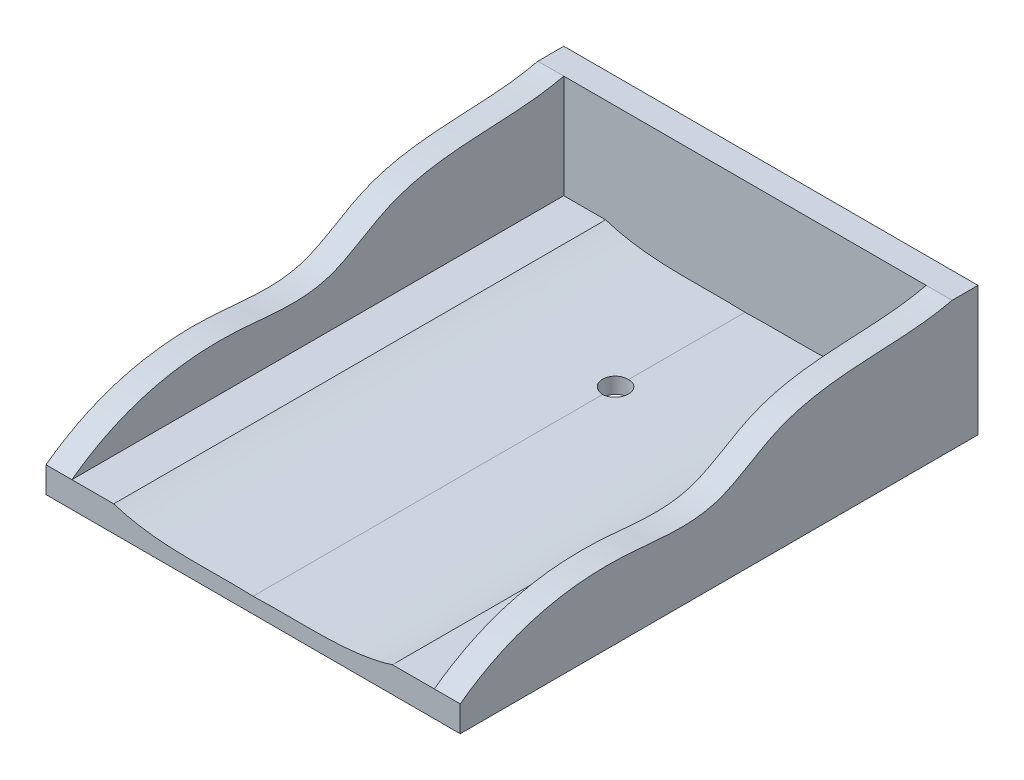
ISO-10303-21;
HEADER;
FILE_DESCRIPTION(('STEP AP214'),'2;1');
FILE_NAME('part.step','',(''),(''),'','','');
FILE_SCHEMA(('AUTOMOTIVE_DESIGN { 1 0 10303 214 1 1 1 1 }'));
ENDSEC;
DATA;
#1=APPLICATION_CONTEXT('core data for automotive mechanical design processes');
#2=APPLICATION_PROTOCOL_DEFINITION('international standard','automotive_design',2000,#1);
#3=PRODUCT_CONTEXT('',#1,'mechanical');
#4=PRODUCT('Part','Part','',(#3));
#5=PRODUCT_RELATED_PRODUCT_CATEGORY('part','',(#4));
#6=PRODUCT_DEFINITION_FORMATION('','',#4);
#7=PRODUCT_DEFINITION_CONTEXT('part definition',#1,'design');
#8=PRODUCT_DEFINITION('design','',#6,#7);
#9=PRODUCT_DEFINITION_SHAPE('','',#8);
#10=(LENGTH_UNIT() NAMED_UNIT(*) SI_UNIT(.MILLI.,.METRE.));
#11=(NAMED_UNIT(*) PLANE_ANGLE_UNIT() SI_UNIT($,.RADIAN.));
#12=(NAMED_UNIT(*) SI_UNIT($,.STERADIAN.) SOLID_ANGLE_UNIT());
#13=UNCERTAINTY_MEASURE_WITH_UNIT(LENGTH_MEASURE(1.E-05),#10,'distance_accuracy_value','');
#14=(GEOMETRIC_REPRESENTATION_CONTEXT(3) GLOBAL_UNCERTAINTY_ASSIGNED_CONTEXT((#13)) GLOBAL_UNIT_ASSIGNED_CONTEXT((#10,
#11,#12)) REPRESENTATION_CONTEXT('',''));
#15=CARTESIAN_POINT('',(0.,0.,0.));
#16=DIRECTION('',(0.,0.,1.));
#17=DIRECTION('',(1.,0.,0.));
#18=AXIS2_PLACEMENT_3D('',#15,#16,#17);
#19=CARTESIAN_POINT('',(0.,0.,-90.));
#20=DIRECTION('',(0.,0.,1.));
#21=DIRECTION('',(1.,0.,0.));
#22=AXIS2_PLACEMENT_3D('',#19,#20,#21);
#23=PLANE('',#22);
#24=DIRECTION('',(1.,0.,0.));
#25=VECTOR('',#24,1.);
#26=CARTESIAN_POINT('',(80.,50.,-90.));
#27=LINE('',#26,#25);
#28=CARTESIAN_POINT('',(-70.,50.,-90.));
#29=VERTEX_POINT('',#28);
#30=CARTESIAN_POINT('',(70.,50.,-90.));
#31=VERTEX_POINT('',#30);
#32=EDGE_CURVE('E182',#29,#31,#27,.T.);
#33=ORIENTED_EDGE('',*,*,#32,.F.);
#34=DIRECTION('',(0.,1.,0.));
#35=VECTOR('',#34,1.);
#36=CARTESIAN_POINT('',(-70.,10.,-90.));
#37=LINE('',#36,#35);
#38=CARTESIAN_POINT('',(-70.,10.,-90.));
#39=VERTEX_POINT('',#38);
#40=EDGE_CURVE('E191',#39,#29,#37,.T.);
#41=ORIENTED_EDGE('',*,*,#40,.F.);
#42=DIRECTION('',(-1.,0.,0.));
#43=VECTOR('',#42,1.);
#44=CARTESIAN_POINT('',(0.,10.,-90.));
#45=LINE('',#44,#43);
#46=CARTESIAN_POINT('',(-53.8268364355321,10.,-90.));
#47=VERTEX_POINT('',#46);
#48=EDGE_CURVE('E270',#47,#39,#45,.T.);
#49=ORIENTED_EDGE('',*,*,#48,.F.);
#50=CARTESIAN_POINT('',(-53.8268364355321,10.,-90.));
#51=CARTESIAN_POINT('',(-36.4733492273273,4.42662265923392,-90.));
#52=CARTESIAN_POINT('',(-17.828472870012,6.79230624745838,-90.));
#53=CARTESIAN_POINT('',(0.,5.99040599040661,-90.));
#54=B_SPLINE_CURVE_WITH_KNOTS('',3,(#50,#51,#52,#53),.UNSPECIFIED.,.F.,.F.,(4,4),(0.,1.),.UNSPECIFIED.);
#55=CARTESIAN_POINT('',(0.,5.99040599040661,-90.));
#56=VERTEX_POINT('',#55);
#57=EDGE_CURVE('E271',#56,#47,#54,.F.);
#58=ORIENTED_EDGE('',*,*,#57,.F.);
#59=CARTESIAN_POINT('',(0.,5.99040599040661,-90.));
#60=CARTESIAN_POINT('',(17.8284728700119,6.79230624745838,-90.));
#61=CARTESIAN_POINT('',(36.4733492273272,4.42662265923392,-90.));
#62=CARTESIAN_POINT('',(53.826836435532,10.,-90.));
#63=B_SPLINE_CURVE_WITH_KNOTS('',3,(#59,#60,#61,#62),.UNSPECIFIED.,.F.,.F.,(4,4),(0.,1.),.UNSPECIFIED.);
#64=CARTESIAN_POINT('',(53.826836435532,10.,-90.));
#65=VERTEX_POINT('',#64);
#66=EDGE_CURVE('E60',#65,#56,#63,.F.);
#67=ORIENTED_EDGE('',*,*,#66,.F.);
#68=DIRECTION('',(-1.,0.,0.));
#69=VECTOR('',#68,1.);
#70=CARTESIAN_POINT('',(0.,10.,-90.));
#71=LINE('',#70,#69);
#72=CARTESIAN_POINT('',(70.,10.,-90.));
#73=VERTEX_POINT('',#72);
#74=EDGE_CURVE('E264',#73,#65,#71,.T.);
#75=ORIENTED_EDGE('',*,*,#74,.F.);
#76=DIRECTION('',(0.,1.,0.));
#77=VECTOR('',#76,1.);
#78=CARTESIAN_POINT('',(70.,10.,-90.));
#79=LINE('',#78,#77);
#80=EDGE_CURVE('E245',#73,#31,#79,.T.);
#81=ORIENTED_EDGE('',*,*,#80,.T.);
#82=EDGE_LOOP('',(#33,#41,#49,#58,#67,#75,#81));
#83=FACE_BOUND('',#82,.T.);
#84=ADVANCED_FACE('F45',(#83),#23,.T.);
#85=CARTESIAN_POINT('',(0.,10.,0.));
#86=DIRECTION('',(0.,-1.,0.));
#87=DIRECTION('',(0.,0.,-1.));
#88=AXIS2_PLACEMENT_3D('',#85,#86,#87);
#89=PLANE('',#88);
#90=DIRECTION('',(0.,0.,-1.));
#91=VECTOR('',#90,1.);
#92=CARTESIAN_POINT('',(-70.,10.,100.));
#93=LINE('',#92,#91);
#94=CARTESIAN_POINT('',(-70.,10.,100.));
#95=VERTEX_POINT('',#94);
#96=EDGE_CURVE('E328',#95,#39,#93,.T.);
#97=ORIENTED_EDGE('',*,*,#96,.F.);
#98=DIRECTION('',(1.,0.,0.));
#99=VECTOR('',#98,1.);
#100=CARTESIAN_POINT('',(-80.,10.,100.));
#101=LINE('',#100,#99);
#102=CARTESIAN_POINT('',(-53.8268364355321,10.,100.));
#103=VERTEX_POINT('',#102);
#104=EDGE_CURVE('E178',#95,#103,#101,.T.);
#105=ORIENTED_EDGE('',*,*,#104,.T.);
#106=DIRECTION('',(0.,0.,1.));
#107=VECTOR('',#106,1.);
#108=CARTESIAN_POINT('',(-53.8268364355321,10.,-100.));
#109=LINE('',#108,#107);
#110=EDGE_CURVE('E161',#47,#103,#109,.T.);
#111=ORIENTED_EDGE('',*,*,#110,.F.);
#112=ORIENTED_EDGE('',*,*,#48,.T.);
#113=EDGE_LOOP('',(#97,#105,#111,#112));
#114=FACE_BOUND('',#113,.T.);
#115=ADVANCED_FACE('F302',(#114),#89,.F.);
#116=DIRECTION('',(0.,0.,-1.));
#117=VECTOR('',#116,1.);
#118=CARTESIAN_POINT('',(70.,10.,100.));
#119=LINE('',#118,#117);
#120=CARTESIAN_POINT('',(70.,10.,100.));
#121=VERTEX_POINT('',#120);
#122=EDGE_CURVE('E243',#121,#73,#119,.T.);
#123=ORIENTED_EDGE('',*,*,#122,.T.);
#124=ORIENTED_EDGE('',*,*,#74,.T.);
#125=DIRECTION('',(0.,0.,1.));
#126=VECTOR('',#125,1.);
#127=CARTESIAN_POINT('',(53.826836435532,10.,-100.));
#128=LINE('',#127,#126);
#129=CARTESIAN_POINT('',(53.826836435532,10.,100.));
#130=VERTEX_POINT('',#129);
#131=EDGE_CURVE('E157',#65,#130,#128,.T.);
#132=ORIENTED_EDGE('',*,*,#131,.T.);
#133=EDGE_CURVE('E173',#130,#121,#101,.T.);
#134=ORIENTED_EDGE('',*,*,#133,.T.);
#135=EDGE_LOOP('',(#123,#124,#132,#134));
#136=FACE_BOUND('',#135,.T.);
#137=ADVANCED_FACE('F263',(#136),#89,.F.);
#138=CARTESIAN_POINT('',(80.,10.,100.));
#139=DIRECTION('',(-1.,0.,0.));
#140=DIRECTION('',(0.,0.,1.));
#141=AXIS2_PLACEMENT_3D('',#138,#139,#140);
#142=PLANE('',#141);
#143=DIRECTION('',(0.,0.,-1.));
#144=VECTOR('',#143,1.);
#145=CARTESIAN_POINT('',(80.,0.,100.));
#146=LINE('',#145,#144);
#147=CARTESIAN_POINT('',(80.,0.,100.));
#148=VERTEX_POINT('',#147);
#149=CARTESIAN_POINT('',(80.,0.,-100.));
#150=VERTEX_POINT('',#149);
#151=EDGE_CURVE('E168',#148,#150,#146,.T.);
#152=ORIENTED_EDGE('',*,*,#151,.T.);
#153=DIRECTION('',(0.,-1.,0.));
#154=VECTOR('',#153,1.);
#155=CARTESIAN_POINT('',(80.,10.,-100.));
#156=LINE('',#155,#154);
#157=CARTESIAN_POINT('',(80.,50.,-100.));
#158=VERTEX_POINT('',#157);
#159=EDGE_CURVE('E378',#158,#150,#156,.T.);
#160=ORIENTED_EDGE('',*,*,#159,.F.);
#161=DIRECTION('',(0.,0.,-1.));
#162=VECTOR('',#161,1.);
#163=CARTESIAN_POINT('',(80.,50.,-90.));
#164=LINE('',#163,#162);
#165=CARTESIAN_POINT('',(80.,50.,-90.));
#166=VERTEX_POINT('',#165);
#167=EDGE_CURVE('E278',#166,#158,#164,.T.);
#168=ORIENTED_EDGE('',*,*,#167,.F.);
#169=CARTESIAN_POINT('',(80.,50.,-90.));
#170=CARTESIAN_POINT('',(80.,44.7808039631701,-68.3711452186165));
#171=CARTESIAN_POINT('',(80.,51.1330094475999,-33.1089414535561));
#172=CARTESIAN_POINT('',(80.,22.9237730017758,3.17482251617077));
#173=CARTESIAN_POINT('',(80.,31.7229557415841,47.8831629840276));
#174=CARTESIAN_POINT('',(80.,23.9097996518622,81.1441295622358));
#175=CARTESIAN_POINT('',(80.,10.,100.));
#176=B_SPLINE_CURVE_WITH_KNOTS('',3,(#169,#170,#171,#172,#173,#174,#175),.UNSPECIFIED.,.F.,.F.,
(4,1,1,1,4),(0.,0.353203894332606,0.479514010542691,0.661603643170161,1.),.UNSPECIFIED.);
#177=CARTESIAN_POINT('',(80.,10.,100.));
#178=VERTEX_POINT('',#177);
#179=EDGE_CURVE('E230',#166,#178,#176,.T.);
#180=ORIENTED_EDGE('',*,*,#179,.T.);
#181=DIRECTION('',(0.,-1.,0.));
#182=VECTOR('',#181,1.);
#183=CARTESIAN_POINT('',(80.,10.,100.));
#184=LINE('',#183,#182);
#185=EDGE_CURVE('E187',#178,#148,#184,.T.);
#186=ORIENTED_EDGE('',*,*,#185,.T.);
#187=EDGE_LOOP('',(#152,#160,#168,#180,#186));
#188=FACE_BOUND('',#187,.T.);
#189=ADVANCED_FACE('F47',(#188),#142,.F.);
#190=CARTESIAN_POINT('',(-80.,10.,-100.));
#191=DIRECTION('',(0.,0.,1.));
#192=DIRECTION('',(1.,0.,0.));
#193=AXIS2_PLACEMENT_3D('',#190,#191,#192);
#194=PLANE('',#193);
#195=DIRECTION('',(0.,-1.,0.));
#196=VECTOR('',#195,1.);
#197=CARTESIAN_POINT('',(-80.,10.,-100.));
#198=LINE('',#197,#196);
#199=CARTESIAN_POINT('',(-80.,50.,-100.));
#200=VERTEX_POINT('',#199);
#201=CARTESIAN_POINT('',(-80.,0.,-100.));
#202=VERTEX_POINT('',#201);
#203=EDGE_CURVE('E375',#200,#202,#198,.T.);
#204=ORIENTED_EDGE('',*,*,#203,.F.);
#205=DIRECTION('',(1.,0.,0.));
#206=VECTOR('',#205,1.);
#207=CARTESIAN_POINT('',(80.,50.,-100.));
#208=LINE('',#207,#206);
#209=EDGE_CURVE('E393',#200,#158,#208,.T.);
#210=ORIENTED_EDGE('',*,*,#209,.T.);
#211=ORIENTED_EDGE('',*,*,#159,.T.);
#212=DIRECTION('',(-1.,0.,0.));
#213=VECTOR('',#212,1.);
#214=CARTESIAN_POINT('',(-80.,0.,-100.));
#215=LINE('',#214,#213);
#216=EDGE_CURVE('E356',#150,#202,#215,.T.);
#217=ORIENTED_EDGE('',*,*,#216,.T.);
#218=EDGE_LOOP('',(#204,#210,#211,#217));
#219=FACE_BOUND('',#218,.T.);
#220=ADVANCED_FACE('F312',(#219),#194,.F.);
#221=CARTESIAN_POINT('',(-80.,10.,100.));
#222=DIRECTION('',(1.,0.,0.));
#223=DIRECTION('',(0.,0.,-1.));
#224=AXIS2_PLACEMENT_3D('',#221,#222,#223);
#225=PLANE('',#224);
#226=DIRECTION('',(0.,-1.,0.));
#227=VECTOR('',#226,1.);
#228=CARTESIAN_POINT('',(-80.,10.,100.));
#229=LINE('',#228,#227);
#230=CARTESIAN_POINT('',(-80.,10.,100.));
#231=VERTEX_POINT('',#230);
#232=CARTESIAN_POINT('',(-80.,0.,100.));
#233=VERTEX_POINT('',#232);
#234=EDGE_CURVE('E372',#231,#233,#229,.T.);
#235=ORIENTED_EDGE('',*,*,#234,.F.);
#236=CARTESIAN_POINT('',(-80.,50.,-90.));
#237=CARTESIAN_POINT('',(-80.,44.7808039631701,-68.3711452186165));
#238=CARTESIAN_POINT('',(-80.,51.1330094475999,-33.1089414535561));
#239=CARTESIAN_POINT('',(-80.,22.9237730017758,3.17482251617077));
#240=CARTESIAN_POINT('',(-80.,31.7229557415841,47.8831629840276));
#241=CARTESIAN_POINT('',(-80.,23.9097996518622,81.1441295622358));
#242=CARTESIAN_POINT('',(-80.,10.,100.));
#243=B_SPLINE_CURVE_WITH_KNOTS('',3,(#236,#237,#238,#239,#240,#241,#242),.UNSPECIFIED.,.F.,.F.,
(4,1,1,1,4),(0.,0.353203894332606,0.479514010542691,0.661603643170161,1.),.UNSPECIFIED.);
#244=CARTESIAN_POINT('',(-80.,50.,-90.));
#245=VERTEX_POINT('',#244);
#246=EDGE_CURVE('E149',#245,#231,#243,.T.);
#247=ORIENTED_EDGE('',*,*,#246,.F.);
#248=DIRECTION('',(0.,0.,-1.));
#249=VECTOR('',#248,1.);
#250=CARTESIAN_POINT('',(-80.,50.,-90.));
#251=LINE('',#250,#249);
#252=EDGE_CURVE('E390',#245,#200,#251,.T.);
#253=ORIENTED_EDGE('',*,*,#252,.T.);
#254=ORIENTED_EDGE('',*,*,#203,.T.);
#255=DIRECTION('',(0.,0.,1.));
#256=VECTOR('',#255,1.);
#257=CARTESIAN_POINT('',(-80.,0.,100.));
#258=LINE('',#257,#256);
#259=EDGE_CURVE('E361',#202,#233,#258,.T.);
#260=ORIENTED_EDGE('',*,*,#259,.T.);
#261=EDGE_LOOP('',(#235,#247,#253,#254,#260));
#262=FACE_BOUND('',#261,.T.);
#263=ADVANCED_FACE('F309',(#262),#225,.F.);
#264=CARTESIAN_POINT('',(-80.,10.,100.));
#265=DIRECTION('',(0.,0.,-1.));
#266=DIRECTION('',(-1.,0.,0.));
#267=AXIS2_PLACEMENT_3D('',#264,#265,#266);
#268=PLANE('',#267);
#269=CARTESIAN_POINT('',(0.,5.99040599040661,100.));
#270=CARTESIAN_POINT('',(17.8284728700119,6.79230624745838,100.));
#271=CARTESIAN_POINT('',(36.4733492273272,4.42662265923392,100.));
#272=CARTESIAN_POINT('',(53.826836435532,10.,100.));
#273=B_SPLINE_CURVE_WITH_KNOTS('',3,(#269,#270,#271,#272),.UNSPECIFIED.,.F.,.F.,(4,4),(0.,1.),.UNSPECIFIED.);
#274=CARTESIAN_POINT('',(0.,5.99040599040661,100.));
#275=VERTEX_POINT('',#274);
#276=EDGE_CURVE('E163',#275,#130,#273,.T.);
#277=ORIENTED_EDGE('',*,*,#276,.F.);
#278=CARTESIAN_POINT('',(-53.8268364355321,10.,100.));
#279=CARTESIAN_POINT('',(-36.4733492273273,4.42662265923392,100.));
#280=CARTESIAN_POINT('',(-17.828472870012,6.79230624745838,100.));
#281=CARTESIAN_POINT('',(0.,5.99040599040661,100.));
#282=B_SPLINE_CURVE_WITH_KNOTS('',3,(#278,#279,#280,#281),.UNSPECIFIED.,.F.,.F.,(4,4),(0.,1.),.UNSPECIFIED.);
#283=EDGE_CURVE('E276',#103,#275,#282,.T.);
#284=ORIENTED_EDGE('',*,*,#283,.F.);
#285=ORIENTED_EDGE('',*,*,#104,.F.);
#286=EDGE_CURVE('E181',#231,#95,#101,.T.);
#287=ORIENTED_EDGE('',*,*,#286,.F.);
#288=ORIENTED_EDGE('',*,*,#234,.T.);
#289=DIRECTION('',(1.,0.,0.));
#290=VECTOR('',#289,1.);
#291=CARTESIAN_POINT('',(-80.,0.,100.));
#292=LINE('',#291,#290);
#293=EDGE_CURVE('E365',#233,#148,#292,.T.);
#294=ORIENTED_EDGE('',*,*,#293,.T.);
#295=ORIENTED_EDGE('',*,*,#185,.F.);
#296=DIRECTION('',(1.,0.,0.));
#297=VECTOR('',#296,1.);
#298=CARTESIAN_POINT('',(70.,10.,100.));
#299=LINE('',#298,#297);
#300=EDGE_CURVE('E249',#121,#178,#299,.T.);
#301=ORIENTED_EDGE('',*,*,#300,.F.);
#302=ORIENTED_EDGE('',*,*,#133,.F.);
#303=EDGE_LOOP('',(#277,#284,#285,#287,#288,#294,#295,#301,#302));
#304=FACE_BOUND('',#303,.T.);
#305=ADVANCED_FACE('F305',(#304),#268,.F.);
#306=CARTESIAN_POINT('',(0.,0.,0.));
#307=DIRECTION('',(0.,-1.,0.));
#308=DIRECTION('',(0.,0.,-1.));
#309=AXIS2_PLACEMENT_3D('',#306,#307,#308);
#310=PLANE('',#309);
#311=CARTESIAN_POINT('',(0.,0.,-40.));
#312=DIRECTION('',(0.,-1.,0.));
#313=DIRECTION('',(0.,0.,-1.));
#314=AXIS2_PLACEMENT_3D('',#311,#312,#313);
#315=CIRCLE('',#314,5.);
#316=CARTESIAN_POINT('',(0.,0.,-45.));
#317=VERTEX_POINT('',#316);
#318=EDGE_CURVE('E150',#317,#317,#315,.T.);
#319=ORIENTED_EDGE('',*,*,#318,.F.);
#320=EDGE_LOOP('',(#319));
#321=FACE_BOUND('',#320,.T.);
#322=ORIENTED_EDGE('',*,*,#293,.F.);
#323=ORIENTED_EDGE('',*,*,#259,.F.);
#324=ORIENTED_EDGE('',*,*,#216,.F.);
#325=ORIENTED_EDGE('',*,*,#151,.F.);
#326=EDGE_LOOP('',(#322,#323,#324,#325));
#327=FACE_BOUND('',#326,.T.);
#328=ADVANCED_FACE('F298',(#321,#327),#310,.T.);
#329=CARTESIAN_POINT('',(-53.8268364355321,10.,-100.));
#330=CARTESIAN_POINT('',(-36.4733492273273,4.42662265923392,-100.));
#331=CARTESIAN_POINT('',(-17.828472870012,6.79230624745838,-100.));
#332=CARTESIAN_POINT('',(0.,5.99040599040661,-100.));
#333=B_SPLINE_CURVE_WITH_KNOTS('',3,(#329,#330,#331,#332),.UNSPECIFIED.,.F.,.F.,(4,4),(0.,1.),.UNSPECIFIED.);
#334=DIRECTION('',(0.,0.,1.));
#335=VECTOR('',#334,1.);
#336=SURFACE_OF_LINEAR_EXTRUSION('',#333,#335);
#337=DIRECTION('',(0.,0.,1.));
#338=VECTOR('',#337,1.);
#339=CARTESIAN_POINT('',(0.,5.99040599040661,-100.));
#340=LINE('',#339,#338);
#341=CARTESIAN_POINT('',(0.,5.99040599040661,-35.));
#342=VERTEX_POINT('',#341);
#343=EDGE_CURVE('E147',#342,#275,#340,.T.);
#344=ORIENTED_EDGE('',*,*,#343,.F.);
#345=CARTESIAN_POINT('',(0.,5.99040599040661,-35.));
#346=CARTESIAN_POINT('',(-0.140568541163598,5.99673042506682,-34.9999848570418));
#347=CARTESIAN_POINT('',(-0.281144366170914,6.00285231950142,-35.0059272284407));
#348=CARTESIAN_POINT('',(-0.561309322978174,6.0146713909433,-35.029622371003));
#349=CARTESIAN_POINT('',(-0.700898496592566,6.0203685860483,-35.0473746385911));
#350=CARTESIAN_POINT('',(-0.978006817814917,6.03131544207908,-35.0945689130136));
#351=CARTESIAN_POINT('',(-1.11552730821945,6.03656540462938,-35.1240029643305));
#352=CARTESIAN_POINT('',(-1.3876148740752,6.04661518047534,-35.194350522018));
#353=CARTESIAN_POINT('',(-1.52218199000862,6.05141499994412,-35.2352638709348));
#354=CARTESIAN_POINT('',(-1.78744762989691,6.06056690993439,-35.3282986772799));
#355=CARTESIAN_POINT('',(-1.91814492751219,6.06491885958572,-35.3804236453074));
#356=CARTESIAN_POINT('',(-2.17474216069314,6.07318325992925,-35.4955270734944));
#357=CARTESIAN_POINT('',(-2.30064030545952,6.07709554760256,-35.5585095376316));
#358=CARTESIAN_POINT('',(-2.54661819918268,6.08449100135249,-35.69482909956));
#359=CARTESIAN_POINT('',(-2.66670125922683,6.08797441341451,-35.7681602095004));
#360=CARTESIAN_POINT('',(-2.90031314985146,6.09453494226859,-35.9247132974361));
#361=CARTESIAN_POINT('',(-3.01383954575972,6.09761190867503,-36.007938914897));
#362=CARTESIAN_POINT('',(-3.23338007445261,6.1033777214078,-36.1835883129851));
#363=CARTESIAN_POINT('',(-3.33940091054394,6.10606691634174,-36.276003704067));
#364=CARTESIAN_POINT('',(-3.54332544234722,6.11108568627059,-36.4694750881706));
#365=CARTESIAN_POINT('',(-3.64122612692553,6.11341512813459,-36.5705342585318));
#366=CARTESIAN_POINT('',(-3.82814845706828,6.11773786274409,-36.7805227183343));
#367=CARTESIAN_POINT('',(-3.91717200479921,6.11973122756669,-36.8894503130894));
#368=CARTESIAN_POINT('',(-4.0857608250427,6.12340799481012,-37.1144621188623));
#369=CARTESIAN_POINT('',(-4.16532259265657,6.12509128249599,-37.2305489578264));
#370=CARTESIAN_POINT('',(-4.31433393220819,6.12816975802103,-37.4689392528645));
#371=CARTESIAN_POINT('',(-4.38379004413158,6.12956513243315,-37.5912386186625));
#372=CARTESIAN_POINT('',(-4.51218098973117,6.13209141082576,-37.8413004491201));
#373=CARTESIAN_POINT('',(-4.5711119311054,6.13322221701428,-37.9690649132613));
#374=CARTESIAN_POINT('',(-4.67797808330956,6.13523746621609,-38.2290495139045));
#375=CARTESIAN_POINT('',(-4.72591805015002,6.13612201582509,-38.3612676946809));
#376=CARTESIAN_POINT('',(-4.81050948094943,6.13766174096124,-38.6293220729421));
#377=CARTESIAN_POINT('',(-4.84715678410248,6.13831683195601,-38.7651595839966));
#378=CARTESIAN_POINT('',(-4.90886728553182,6.13940952661444,-39.0393918615848));
#379=CARTESIAN_POINT('',(-4.93393452281235,6.13984720611294,-39.17778571895));
#380=CARTESIAN_POINT('',(-4.97233213728264,6.14051421942141,-39.456241784453));
#381=CARTESIAN_POINT('',(-4.98565843006893,6.14074348072839,-39.5963045560075));
#382=CARTESIAN_POINT('',(-5.00046331963966,6.14099803349703,-39.8770338824183));
#383=CARTESIAN_POINT('',(-5.00194369867967,6.14102335564199,-40.0177003432612));
#384=CARTESIAN_POINT('',(-4.993050919494,6.1408706294644,-40.2986579704898));
#385=CARTESIAN_POINT('',(-4.9826777611664,6.14069258114011,-40.4389491368723));
#386=CARTESIAN_POINT('',(-4.9501488093876,6.14012943599993,-40.7181836644585));
#387=CARTESIAN_POINT('',(-4.92799092052362,6.13974430236261,-40.8571267814938));
#388=CARTESIAN_POINT('',(-4.87205869617364,6.13875943482199,-41.1326037310733));
#389=CARTESIAN_POINT('',(-4.83828840155452,6.13815977556606,-41.269138384359));
#390=CARTESIAN_POINT('',(-4.75935594686011,6.13673399584023,-41.5389255329692));
#391=CARTESIAN_POINT('',(-4.71418975293872,6.13590779517166,-41.6721768477073));
#392=CARTESIAN_POINT('',(-4.61281172777193,6.13401415081836,-41.9343510367642));
#393=CARTESIAN_POINT('',(-4.55660396661738,6.13294679600503,-42.0632754855903));
#394=CARTESIAN_POINT('',(-4.43350836295535,6.13055175833977,-42.3159801937001));
#395=CARTESIAN_POINT('',(-4.36661639031711,6.12922397477004,-42.4397584402322));
#396=CARTESIAN_POINT('',(-4.22267108213576,6.12628766891746,-42.6811927134334));
#397=CARTESIAN_POINT('',(-4.14562150577453,6.12467925042264,-42.7988509826615));
#398=CARTESIAN_POINT('',(-3.98186419569925,6.12115746296695,-43.0272949281733));
#399=CARTESIAN_POINT('',(-3.89515337881914,6.11924399657255,-43.1380783928569));
#400=CARTESIAN_POINT('',(-3.71274525505683,6.11508855785986,-43.3519045331095));
#401=CARTESIAN_POINT('',(-3.61705127691206,6.11284670705419,-43.4549500507205));
#402=CARTESIAN_POINT('',(-3.41730879509955,6.10800830058942,-43.6526359233124));
#403=CARTESIAN_POINT('',(-3.31325842005582,6.10541166538619,-43.7472743855225));
#404=CARTESIAN_POINT('',(-3.09760320253932,6.09984052439305,-43.9274147455496));
#405=CARTESIAN_POINT('',(-2.98600116021161,6.09686615831027,-44.0129199999468));
#406=CARTESIAN_POINT('',(-2.75592451997865,6.09051379262328,-44.1742827880837));
#407=CARTESIAN_POINT('',(-2.63744528145679,6.08713551880084,-44.2501336943996));
#408=CARTESIAN_POINT('',(-2.39457331128947,6.07995835870472,-44.3915553120947));
#409=CARTESIAN_POINT('',(-2.27018277613423,6.07615962797568,-44.4571298036058));
#410=CARTESIAN_POINT('',(-2.01619628608026,6.06812056057635,-44.5776338656212));
#411=CARTESIAN_POINT('',(-1.88659482425854,6.06387974875454,-44.6325517972166));
#412=CARTESIAN_POINT('',(-1.62328681162163,6.05495153423902,-44.7312471596968));
#413=CARTESIAN_POINT('',(-1.48958181940914,6.05026429971698,-44.7750287631062));
#414=CARTESIAN_POINT('',(-1.21912541286717,6.04044441826501,-44.8511285776129));
#415=CARTESIAN_POINT('',(-1.08237747089008,6.03531226143393,-44.8834592075991));
#416=CARTESIAN_POINT('',(-0.806717159579012,6.02460522854163,-44.9364858781336));
#417=CARTESIAN_POINT('',(-0.667805880480119,6.01903057002797,-44.9571875958765));
#418=CARTESIAN_POINT('',(-0.440496081939558,6.00959862800749,-44.9813416737265));
#419=CARTESIAN_POINT('',(-0.352454059559902,6.00587043402084,-44.9883433032751));
#420=CARTESIAN_POINT('',(-0.176276532201482,5.99825633585054,-44.9976691129862));
#421=CARTESIAN_POINT('',(-0.0881414260701609,5.99437070420531,-45.0000010511737));
#422=CARTESIAN_POINT('',(0.,5.99040599040661,-45.));
#423=B_SPLINE_CURVE_WITH_KNOTS('',3,(#345,#346,#347,#348,#349,#350,#351,#352,#353,#354,#355,
#356,#357,#358,#359,#360,#361,#362,#363,#364,#365,#366,#367,#368,#369,#370,#371,#372,#373,#374,
#375,#376,#377,#378,#379,#380,#381,#382,#383,#384,#385,#386,#387,#388,#389,#390,#391,#392,#393,
#394,#395,#396,#397,#398,#399,#400,#401,#402,#403,#404,#405,#406,#407,#408,#409,#410,#411,#412,
#413,#414,#415,#416,#417,#418,#419,#420,#421,#422),.UNSPECIFIED.,.F.,.F.,(4,2,2,2,2,2,2,2,2,2,2,
2,2,2,2,2,2,2,2,2,2,2,2,2,2,2,2,2,2,2,2,2,2,2,2,2,2,2,4),(0.,0.422004105924996,
0.843990218703621,1.26568944266262,1.68738288273356,2.10920855681673,2.53119012391991,
2.95292852094503,3.37482252743527,3.79633485325563,4.21800279288142,4.63958018371665,
5.06131325495542,5.48277217132747,5.90438662569487,6.32581829340938,6.74740505336044,
7.16884465708954,7.59043081210256,8.01195353693894,8.43347626539908,8.85507396880579,
9.27652511351366,9.69812565055605,10.1195710698153,10.5411798007267,10.9626329360954,
11.3842209560099,11.8056533672764,12.2271804209485,12.6485520206789,13.0702113370962,
13.4917151821538,13.9136768267499,14.3354801384179,14.7568245820941,15.1779631476993,
15.4430450660237,15.7076862220207),.UNSPECIFIED.);
#424=CARTESIAN_POINT('',(0.,5.99040599040661,-45.));
#425=VERTEX_POINT('',#424);
#426=EDGE_CURVE('E66',#342,#425,#423,.T.);
#427=ORIENTED_EDGE('',*,*,#426,.T.);
#428=EDGE_CURVE('E145',#56,#425,#340,.T.);
#429=ORIENTED_EDGE('',*,*,#428,.F.);
#430=ORIENTED_EDGE('',*,*,#57,.T.);
#431=ORIENTED_EDGE('',*,*,#110,.T.);
#432=ORIENTED_EDGE('',*,*,#283,.T.);
#433=EDGE_LOOP('',(#344,#427,#429,#430,#431,#432));
#434=FACE_BOUND('',#433,.T.);
#435=ADVANCED_FACE('F143',(#434),#336,.F.);
#436=CARTESIAN_POINT('',(0.,5.99040599040661,-100.));
#437=CARTESIAN_POINT('',(17.8284728700119,6.79230624745838,-100.));
#438=CARTESIAN_POINT('',(36.4733492273272,4.42662265923392,-100.));
#439=CARTESIAN_POINT('',(53.826836435532,10.,-100.));
#440=B_SPLINE_CURVE_WITH_KNOTS('',3,(#436,#437,#438,#439),.UNSPECIFIED.,.F.,.F.,(4,4),(0.,1.),.UNSPECIFIED.);
#441=DIRECTION('',(0.,0.,1.));
#442=VECTOR('',#441,1.);
#443=SURFACE_OF_LINEAR_EXTRUSION('',#440,#442);
#444=ORIENTED_EDGE('',*,*,#428,.T.);
#445=CARTESIAN_POINT('',(0.,5.99040599040661,-45.));
#446=CARTESIAN_POINT('',(0.140568541163515,5.99673042506683,-45.0000151429582));
#447=CARTESIAN_POINT('',(0.28114436617083,6.00285231950142,-44.9940727715593));
#448=CARTESIAN_POINT('',(0.561309322978092,6.0146713909433,-44.970377628997));
#449=CARTESIAN_POINT('',(0.700898496592484,6.0203685860483,-44.9526253614089));
#450=CARTESIAN_POINT('',(0.978006817814837,6.03131544207908,-44.9054310869864));
#451=CARTESIAN_POINT('',(1.11552730821937,6.03656540462938,-44.8759970356695));
#452=CARTESIAN_POINT('',(1.38761487407512,6.04661518047534,-44.805649477982));
#453=CARTESIAN_POINT('',(1.52218199000854,6.05141499994412,-44.7647361290652));
#454=CARTESIAN_POINT('',(1.78744762989684,6.06056690993439,-44.6717013227201));
#455=CARTESIAN_POINT('',(1.91814492751212,6.06491885958572,-44.6195763546926));
#456=CARTESIAN_POINT('',(2.17474216069307,6.07318325992925,-44.5044729265056));
#457=CARTESIAN_POINT('',(2.30064030545945,6.07709554760257,-44.4414904623684));
#458=CARTESIAN_POINT('',(2.54661819918261,6.08449100135249,-44.30517090044));
#459=CARTESIAN_POINT('',(2.66670125922676,6.08797441341451,-44.2318397904997));
#460=CARTESIAN_POINT('',(2.9003131498514,6.09453494226859,-44.0752867025639));
#461=CARTESIAN_POINT('',(3.01383954575966,6.09761190867503,-43.992061085103));
#462=CARTESIAN_POINT('',(3.23338007445255,6.1033777214078,-43.8164116870149));
#463=CARTESIAN_POINT('',(3.33940091054388,6.10606691634174,-43.7239962959331));
#464=CARTESIAN_POINT('',(3.54332544234716,6.11108568627059,-43.5305249118294));
#465=CARTESIAN_POINT('',(3.64122612692547,6.11341512813459,-43.4294657414682));
#466=CARTESIAN_POINT('',(3.82814845706823,6.11773786274409,-43.2194772816658));
#467=CARTESIAN_POINT('',(3.91717200479917,6.11973122756669,-43.1105496869107));
#468=CARTESIAN_POINT('',(4.08576082504266,6.12340799481012,-42.8855378811377));
#469=CARTESIAN_POINT('',(4.16532259265653,6.12509128249599,-42.7694510421737));
#470=CARTESIAN_POINT('',(4.31433393220815,6.12816975802103,-42.5310607471355));
#471=CARTESIAN_POINT('',(4.38379004413155,6.12956513243315,-42.4087613813376));
#472=CARTESIAN_POINT('',(4.51218098973113,6.13209141082576,-42.15869955088));
#473=CARTESIAN_POINT('',(4.57111193110537,6.13322221701428,-42.0309350867388));
#474=CARTESIAN_POINT('',(4.67797808330954,6.13523746621609,-41.7709504860955));
#475=CARTESIAN_POINT('',(4.72591805014999,6.13612201582509,-41.6387323053192));
#476=CARTESIAN_POINT('',(4.81050948094941,6.13766174096124,-41.3706779270579));
#477=CARTESIAN_POINT('',(4.84715678410246,6.13831683195601,-41.2348404160035));
#478=CARTESIAN_POINT('',(4.9088672855318,6.13940952661444,-40.9606081384153));
#479=CARTESIAN_POINT('',(4.93393452281233,6.13984720611294,-40.82221428105));
#480=CARTESIAN_POINT('',(4.97233213728263,6.14051421942141,-40.5437582155471));
#481=CARTESIAN_POINT('',(4.98565843006892,6.1407434807284,-40.4036954439926));
#482=CARTESIAN_POINT('',(5.00046331963966,6.14099803349703,-40.1229661175818));
#483=CARTESIAN_POINT('',(5.00194369867967,6.14102335564199,-39.9822996567389));
#484=CARTESIAN_POINT('',(4.993050919494,6.14087062946441,-39.7013420295103));
#485=CARTESIAN_POINT('',(4.98267776116641,6.14069258114012,-39.5610508631278));
#486=CARTESIAN_POINT('',(4.95014880938761,6.14012943599994,-39.2818163355416));
#487=CARTESIAN_POINT('',(4.92799092052363,6.13974430236261,-39.1428732185062));
#488=CARTESIAN_POINT('',(4.87205869617366,6.13875943482199,-38.8673962689267));
#489=CARTESIAN_POINT('',(4.83828840155453,6.13815977556606,-38.7308616156411));
#490=CARTESIAN_POINT('',(4.75935594686013,6.13673399584023,-38.4610744670309));
#491=CARTESIAN_POINT('',(4.71418975293875,6.13590779517167,-38.3278231522927));
#492=CARTESIAN_POINT('',(4.61281172777195,6.13401415081836,-38.0656489632359));
#493=CARTESIAN_POINT('',(4.55660396661741,6.13294679600504,-37.9367245144097));
#494=CARTESIAN_POINT('',(4.43350836295539,6.13055175833977,-37.6840198062999));
#495=CARTESIAN_POINT('',(4.36661639031715,6.12922397477004,-37.5602415597678));
#496=CARTESIAN_POINT('',(4.2226710821358,6.12628766891746,-37.3188072865666));
#497=CARTESIAN_POINT('',(4.14562150577457,6.12467925042264,-37.2011490173386));
#498=CARTESIAN_POINT('',(3.98186419569929,6.12115746296696,-36.9727050718268));
#499=CARTESIAN_POINT('',(3.89515337881919,6.11924399657255,-36.8619216071431));
#500=CARTESIAN_POINT('',(3.71274525505688,6.11508855785986,-36.6480954668905));
#501=CARTESIAN_POINT('',(3.61705127691211,6.1128467070542,-36.5450499492796));
#502=CARTESIAN_POINT('',(3.41730879509961,6.10800830058943,-36.3473640766877));
#503=CARTESIAN_POINT('',(3.31325842005588,6.10541166538619,-36.2527256144775));
#504=CARTESIAN_POINT('',(3.09760320253939,6.09984052439305,-36.0725852544504));
#505=CARTESIAN_POINT('',(2.98600116021168,6.09686615831028,-35.9870800000533));
#506=CARTESIAN_POINT('',(2.75592451997873,6.09051379262328,-35.8257172119163));
#507=CARTESIAN_POINT('',(2.63744528145687,6.08713551880085,-35.7498663056004));
#508=CARTESIAN_POINT('',(2.39457331128955,6.07995835870473,-35.6084446879053));
#509=CARTESIAN_POINT('',(2.2701827761343,6.07615962797569,-35.5428701963943));
#510=CARTESIAN_POINT('',(2.01619628608033,6.06812056057635,-35.4223661343789));
#511=CARTESIAN_POINT('',(1.88659482425861,6.06387974875455,-35.3674482027834));
#512=CARTESIAN_POINT('',(1.6232868116217,6.05495153423903,-35.2687528403032));
#513=CARTESIAN_POINT('',(1.48958181940921,6.05026429971698,-35.2249712368938));
#514=CARTESIAN_POINT('',(1.21912541286724,6.04044441826502,-35.1488714223871));
#515=CARTESIAN_POINT('',(1.08237747089015,6.03531226143394,-35.1165407924009));
#516=CARTESIAN_POINT('',(0.806717159579088,6.02460522854163,-35.0635141218664));
#517=CARTESIAN_POINT('',(0.6678058804802,6.01903057002798,-35.0428124041234));
#518=CARTESIAN_POINT('',(0.440496081939613,6.0095986280075,-35.0186583262735));
#519=CARTESIAN_POINT('',(0.352454059559929,6.00587043402084,-35.0116566967249));
#520=CARTESIAN_POINT('',(0.176276532201452,5.99825633585054,-35.0023308870138));
#521=CARTESIAN_POINT('',(0.0881414260701027,5.99437070420532,-34.9999989488263));
#522=CARTESIAN_POINT('',(0.,5.99040599040661,-35.));
#523=B_SPLINE_CURVE_WITH_KNOTS('',3,(#445,#446,#447,#448,#449,#450,#451,#452,#453,#454,#455,
#456,#457,#458,#459,#460,#461,#462,#463,#464,#465,#466,#467,#468,#469,#470,#471,#472,#473,#474,
#475,#476,#477,#478,#479,#480,#481,#482,#483,#484,#485,#486,#487,#488,#489,#490,#491,#492,#493,
#494,#495,#496,#497,#498,#499,#500,#501,#502,#503,#504,#505,#506,#507,#508,#509,#510,#511,#512,
#513,#514,#515,#516,#517,#518,#519,#520,#521,#522),.UNSPECIFIED.,.F.,.F.,(4,2,2,2,2,2,2,2,2,2,2,
2,2,2,2,2,2,2,2,2,2,2,2,2,2,2,2,2,2,2,2,2,2,2,2,2,2,2,4),(0.,0.422004105924996,
0.843990218703623,1.26568944266263,1.68738288273356,2.10920855681673,2.53119012391991,
2.95292852094503,3.37482252743527,3.79633485325563,4.21800279288143,4.63958018371667,
5.06131325495544,5.48277217132748,5.90438662569487,6.32581829340939,6.74740505336043,
7.16884465708953,7.59043081210256,8.01195353693894,8.43347626539908,8.85507396880581,
9.27652511351366,9.69812565055606,10.1195710698153,10.5411798007267,10.9626329360954,
11.3842209560099,11.8056533672764,12.2271804209485,12.6485520206789,13.0702113370962,
13.4917151821538,13.9136768267499,14.3354801384179,14.7568245820941,15.1779631476993,
15.4430450660238,15.7076862220209),.UNSPECIFIED.);
#524=EDGE_CURVE('E11',#425,#342,#523,.T.);
#525=ORIENTED_EDGE('',*,*,#524,.T.);
#526=ORIENTED_EDGE('',*,*,#343,.T.);
#527=ORIENTED_EDGE('',*,*,#276,.T.);
#528=ORIENTED_EDGE('',*,*,#131,.F.);
#529=ORIENTED_EDGE('',*,*,#66,.T.);
#530=EDGE_LOOP('',(#444,#525,#526,#527,#528,#529));
#531=FACE_BOUND('',#530,.T.);
#532=ADVANCED_FACE('F153',(#531),#443,.F.);
#533=CARTESIAN_POINT('',(80.,50.,-90.));
#534=DIRECTION('',(0.,1.,0.));
#535=DIRECTION('',(0.,0.,1.));
#536=AXIS2_PLACEMENT_3D('',#533,#534,#535);
#537=PLANE('',#536);
#538=ORIENTED_EDGE('',*,*,#209,.F.);
#539=ORIENTED_EDGE('',*,*,#252,.F.);
#540=EDGE_CURVE('E384',#245,#29,#27,.T.);
#541=ORIENTED_EDGE('',*,*,#540,.T.);
#542=ORIENTED_EDGE('',*,*,#32,.T.);
#543=DIRECTION('',(1.,0.,0.));
#544=VECTOR('',#543,1.);
#545=CARTESIAN_POINT('',(70.,50.,-90.));
#546=LINE('',#545,#544);
#547=EDGE_CURVE('E254',#31,#166,#546,.T.);
#548=ORIENTED_EDGE('',*,*,#547,.T.);
#549=ORIENTED_EDGE('',*,*,#167,.T.);
#550=EDGE_LOOP('',(#538,#539,#541,#542,#548,#549));
#551=FACE_BOUND('',#550,.T.);
#552=ADVANCED_FACE('F223',(#551),#537,.T.);
#553=CARTESIAN_POINT('',(70.,50.,-90.));
#554=CARTESIAN_POINT('',(70.,44.7808039631701,-68.3711452186165));
#555=CARTESIAN_POINT('',(70.,51.1330094475999,-33.1089414535561));
#556=CARTESIAN_POINT('',(70.,22.9237730017758,3.17482251617077));
#557=CARTESIAN_POINT('',(70.,31.7229557415841,47.8831629840276));
#558=CARTESIAN_POINT('',(70.,23.9097996518622,81.1441295622358));
#559=CARTESIAN_POINT('',(70.,10.,100.));
#560=B_SPLINE_CURVE_WITH_KNOTS('',3,(#553,#554,#555,#556,#557,#558,#559),.UNSPECIFIED.,.F.,.F.,
(4,1,1,1,4),(0.,0.353203894332606,0.479514010542691,0.661603643170161,1.),.UNSPECIFIED.);
#561=DIRECTION('',(1.,0.,0.));
#562=VECTOR('',#561,1.);
#563=SURFACE_OF_LINEAR_EXTRUSION('',#560,#562);
#564=ORIENTED_EDGE('',*,*,#179,.F.);
#565=ORIENTED_EDGE('',*,*,#547,.F.);
#566=EDGE_CURVE('E238',#31,#121,#560,.T.);
#567=ORIENTED_EDGE('',*,*,#566,.T.);
#568=ORIENTED_EDGE('',*,*,#300,.T.);
#569=EDGE_LOOP('',(#564,#565,#567,#568));
#570=FACE_BOUND('',#569,.T.);
#571=ADVANCED_FACE('F219',(#570),#563,.T.);
#572=CARTESIAN_POINT('',(70.,27.2252546873572,4.64011082631774));
#573=DIRECTION('',(1.,0.,0.));
#574=DIRECTION('',(0.,0.,-1.));
#575=AXIS2_PLACEMENT_3D('',#572,#573,#574);
#576=PLANE('',#575);
#577=ORIENTED_EDGE('',*,*,#566,.F.);
#578=ORIENTED_EDGE('',*,*,#80,.F.);
#579=ORIENTED_EDGE('',*,*,#122,.F.);
#580=EDGE_LOOP('',(#577,#578,#579));
#581=FACE_BOUND('',#580,.T.);
#582=ADVANCED_FACE('F216',(#581),#576,.F.);
#583=CARTESIAN_POINT('',(-70.,50.,-90.));
#584=CARTESIAN_POINT('',(-70.,44.7808039631701,-68.3711452186165));
#585=CARTESIAN_POINT('',(-70.,51.1330094475999,-33.1089414535561));
#586=CARTESIAN_POINT('',(-70.,22.9237730017758,3.17482251617077));
#587=CARTESIAN_POINT('',(-70.,31.7229557415841,47.8831629840276));
#588=CARTESIAN_POINT('',(-70.,23.9097996518622,81.1441295622358));
#589=CARTESIAN_POINT('',(-70.,10.,100.));
#590=B_SPLINE_CURVE_WITH_KNOTS('',3,(#583,#584,#585,#586,#587,#588,#589),.UNSPECIFIED.,.F.,.F.,
(4,1,1,1,4),(0.,0.353203894332606,0.479514010542691,0.661603643170161,1.),.UNSPECIFIED.);
#591=DIRECTION('',(-1.,0.,0.));
#592=VECTOR('',#591,1.);
#593=SURFACE_OF_LINEAR_EXTRUSION('',#590,#592);
#594=ORIENTED_EDGE('',*,*,#246,.T.);
#595=ORIENTED_EDGE('',*,*,#286,.T.);
#596=EDGE_CURVE('E73',#29,#95,#590,.T.);
#597=ORIENTED_EDGE('',*,*,#596,.F.);
#598=ORIENTED_EDGE('',*,*,#540,.F.);
#599=EDGE_LOOP('',(#594,#595,#597,#598));
#600=FACE_BOUND('',#599,.T.);
#601=ADVANCED_FACE('F211',(#600),#593,.F.);
#602=CARTESIAN_POINT('',(-70.,27.2252546873572,4.64011082631774));
#603=DIRECTION('',(-1.,0.,0.));
#604=DIRECTION('',(0.,0.,-1.));
#605=AXIS2_PLACEMENT_3D('',#602,#603,#604);
#606=PLANE('',#605);
#607=ORIENTED_EDGE('',*,*,#596,.T.);
#608=ORIENTED_EDGE('',*,*,#96,.T.);
#609=ORIENTED_EDGE('',*,*,#40,.T.);
#610=EDGE_LOOP('',(#607,#608,#609));
#611=FACE_BOUND('',#610,.T.);
#612=ADVANCED_FACE('F215',(#611),#606,.F.);
#613=CARTESIAN_POINT('',(0.,51.1330344475999,-40.));
#614=DIRECTION('',(0.,-1.,0.));
#615=DIRECTION('',(0.,0.,-1.));
#616=AXIS2_PLACEMENT_3D('',#613,#614,#615);
#617=CYLINDRICAL_SURFACE('',#616,5.);
#618=ORIENTED_EDGE('',*,*,#318,.T.);
#619=EDGE_LOOP('',(#618));
#620=FACE_BOUND('',#619,.T.);
#621=ORIENTED_EDGE('',*,*,#524,.F.);
#622=ORIENTED_EDGE('',*,*,#426,.F.);
#623=EDGE_LOOP('',(#621,#622));
#624=FACE_BOUND('',#623,.T.);
#625=ADVANCED_FACE('F137',(#620,#624),#617,.F.);
#626=CLOSED_SHELL('',(#84,#115,#137,#189,#220,#263,#305,#328,#435,#532,#552,#571,#582,#601,#612,#625));
#627=MANIFOLD_SOLID_BREP('B2',#626);
#628=ADVANCED_BREP_SHAPE_REPRESENTATION('',(#18,#627),#14);
#629=SHAPE_DEFINITION_REPRESENTATION(#9,#628);
ENDSEC;
END-ISO-10303-21;
